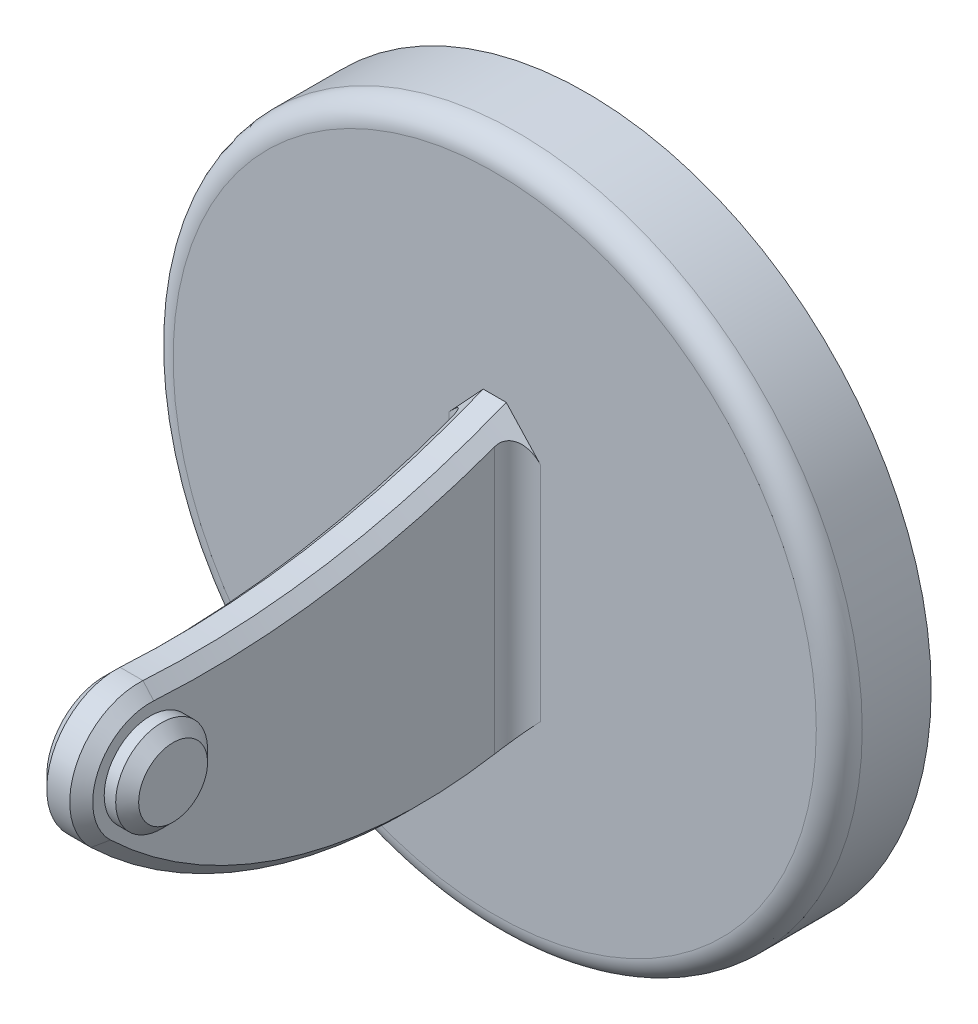
ISO-10303-21;
HEADER;
FILE_DESCRIPTION(('STEP AP214'),'2;1');
FILE_NAME('part.step','',(''),(''),'','','');
FILE_SCHEMA(('AUTOMOTIVE_DESIGN { 1 0 10303 214 1 1 1 1 }'));
ENDSEC;
DATA;
#1=APPLICATION_CONTEXT('core data for automotive mechanical design processes');
#2=APPLICATION_PROTOCOL_DEFINITION('international standard','automotive_design',2000,#1);
#3=PRODUCT_CONTEXT('',#1,'mechanical');
#4=PRODUCT('Part','Part','',(#3));
#5=PRODUCT_RELATED_PRODUCT_CATEGORY('part','',(#4));
#6=PRODUCT_DEFINITION_FORMATION('','',#4);
#7=PRODUCT_DEFINITION_CONTEXT('part definition',#1,'design');
#8=PRODUCT_DEFINITION('design','',#6,#7);
#9=PRODUCT_DEFINITION_SHAPE('','',#8);
#10=(LENGTH_UNIT() NAMED_UNIT(*) SI_UNIT(.MILLI.,.METRE.));
#11=(NAMED_UNIT(*) PLANE_ANGLE_UNIT() SI_UNIT($,.RADIAN.));
#12=(NAMED_UNIT(*) SI_UNIT($,.STERADIAN.) SOLID_ANGLE_UNIT());
#13=UNCERTAINTY_MEASURE_WITH_UNIT(LENGTH_MEASURE(1.E-05),#10,'distance_accuracy_value','');
#14=(GEOMETRIC_REPRESENTATION_CONTEXT(3) GLOBAL_UNCERTAINTY_ASSIGNED_CONTEXT((#13)) GLOBAL_UNIT_ASSIGNED_CONTEXT((#10,
#11,#12)) REPRESENTATION_CONTEXT('',''));
#15=CARTESIAN_POINT('',(0.,0.,0.));
#16=DIRECTION('',(0.,0.,1.));
#17=DIRECTION('',(1.,0.,0.));
#18=AXIS2_PLACEMENT_3D('',#15,#16,#17);
#19=CARTESIAN_POINT('',(0.,0.,20.));
#20=DIRECTION('',(0.,0.,-1.));
#21=DIRECTION('',(-1.,0.,0.));
#22=AXIS2_PLACEMENT_3D('',#19,#20,#21);
#23=CYLINDRICAL_SURFACE('',#22,75.);
#24=CARTESIAN_POINT('',(0.,0.,15.));
#25=DIRECTION('',(0.,0.,1.));
#26=DIRECTION('',(1.,0.,0.));
#27=AXIS2_PLACEMENT_3D('',#24,#25,#26);
#28=CIRCLE('',#27,75.);
#29=CARTESIAN_POINT('',(75.,0.,15.));
#30=VERTEX_POINT('',#29);
#31=EDGE_CURVE('E142',#30,#30,#28,.F.);
#32=ORIENTED_EDGE('',*,*,#31,.T.);
#33=EDGE_LOOP('',(#32));
#34=FACE_BOUND('',#33,.T.);
#35=CARTESIAN_POINT('',(0.,0.,0.));
#36=DIRECTION('',(0.,0.,1.));
#37=DIRECTION('',(1.,0.,0.));
#38=AXIS2_PLACEMENT_3D('',#35,#36,#37);
#39=CIRCLE('',#38,75.);
#40=CARTESIAN_POINT('',(75.,0.,0.));
#41=VERTEX_POINT('',#40);
#42=EDGE_CURVE('E310',#41,#41,#39,.T.);
#43=ORIENTED_EDGE('',*,*,#42,.T.);
#44=EDGE_LOOP('',(#43));
#45=FACE_BOUND('',#44,.T.);
#46=ADVANCED_FACE('F41',(#34,#45),#23,.T.);
#47=CARTESIAN_POINT('',(0.,0.,20.));
#48=DIRECTION('',(0.,0.,1.));
#49=DIRECTION('',(1.,0.,0.));
#50=AXIS2_PLACEMENT_3D('',#47,#48,#49);
#51=PLANE('',#50);
#52=DIRECTION('',(0.,1.,0.));
#53=VECTOR('',#52,1.);
#54=CARTESIAN_POINT('',(-10.,0.,20.));
#55=LINE('',#54,#53);
#56=CARTESIAN_POINT('',(-10.,-28.5347400447998,20.));
#57=VERTEX_POINT('',#56);
#58=CARTESIAN_POINT('',(-10.,19.8084097202197,20.));
#59=VERTEX_POINT('',#58);
#60=EDGE_CURVE('E276',#57,#59,#55,.T.);
#61=ORIENTED_EDGE('',*,*,#60,.T.);
#62=CARTESIAN_POINT('',(-10.,19.8084097202197,20.));
#63=CARTESIAN_POINT('',(-9.16574365323036,20.7032286114695,20.));
#64=CARTESIAN_POINT('',(-8.33193432974239,21.5984643871198,20.));
#65=CARTESIAN_POINT('',(-6.6652533617684,23.3898068938445,20.));
#66=CARTESIAN_POINT('',(-5.83238171646611,24.2859136241594,20.));
#67=CARTESIAN_POINT('',(-4.16616784041951,26.0805990637617,20.));
#68=CARTESIAN_POINT('',(-3.33282731858596,26.979179359604,20.));
#69=CARTESIAN_POINT('',(-2.50000000000003,27.8782351753599,20.));
#70=B_SPLINE_CURVE_WITH_KNOTS('',3,(#62,#63,#64,#65,#66,#67,#68,#69),.UNSPECIFIED.,.F.,.F.,(4,2,
2,4),(0.,3.67017170974664,7.34034022201677,11.0169040821687),.UNSPECIFIED.);
#71=CARTESIAN_POINT('',(-2.50000000000003,27.8782351753599,20.));
#72=VERTEX_POINT('',#71);
#73=EDGE_CURVE('E131',#59,#72,#70,.T.);
#74=ORIENTED_EDGE('',*,*,#73,.T.);
#75=DIRECTION('',(-1.,0.,0.));
#76=VECTOR('',#75,1.);
#77=CARTESIAN_POINT('',(5.,27.8782351753599,20.));
#78=LINE('',#77,#76);
#79=CARTESIAN_POINT('',(2.50000000000011,27.8782351753599,20.));
#80=VERTEX_POINT('',#79);
#81=EDGE_CURVE('E141',#80,#72,#78,.T.);
#82=ORIENTED_EDGE('',*,*,#81,.F.);
#83=CARTESIAN_POINT('',(2.50000000000011,27.8782351753599,20.));
#84=CARTESIAN_POINT('',(3.33282731858601,26.979179359604,20.));
#85=CARTESIAN_POINT('',(4.16616784041952,26.0805990637617,20.));
#86=CARTESIAN_POINT('',(5.8323817164661,24.2859136241593,20.));
#87=CARTESIAN_POINT('',(6.66525336176839,23.3898068938444,20.));
#88=CARTESIAN_POINT('',(8.33193432974238,21.5984643871197,20.));
#89=CARTESIAN_POINT('',(9.16574365323035,20.7032286114694,20.));
#90=CARTESIAN_POINT('',(10.,19.8084097202195,20.));
#91=B_SPLINE_CURVE_WITH_KNOTS('',3,(#83,#84,#85,#86,#87,#88,#89,#90),.UNSPECIFIED.,.F.,.F.,(4,2,
2,4),(0.,3.67656386015188,7.34673237242206,11.0169040821688),.UNSPECIFIED.);
#92=CARTESIAN_POINT('',(10.,19.8084097202195,20.));
#93=VERTEX_POINT('',#92);
#94=EDGE_CURVE('E130',#80,#93,#91,.T.);
#95=ORIENTED_EDGE('',*,*,#94,.T.);
#96=DIRECTION('',(0.,1.,0.));
#97=VECTOR('',#96,1.);
#98=CARTESIAN_POINT('',(10.,-33.6654972978262,20.));
#99=LINE('',#98,#97);
#100=CARTESIAN_POINT('',(10.,-28.5347400447897,20.));
#101=VERTEX_POINT('',#100);
#102=EDGE_CURVE('E128',#93,#101,#99,.F.);
#103=ORIENTED_EDGE('',*,*,#102,.T.);
#104=CARTESIAN_POINT('',(9.99999999999999,-28.5347400447897,20.));
#105=CARTESIAN_POINT('',(9.1672779060872,-29.3904619495378,20.));
#106=CARTESIAN_POINT('',(8.33423473892486,-30.2458713230867,20.));
#107=CARTESIAN_POINT('',(6.6675526869515,-31.9561089872226,20.));
#108=CARTESIAN_POINT('',(5.83391380233608,-32.8109372780004,20.));
#109=CARTESIAN_POINT('',(4.16693335697095,-34.5191891841924,20.));
#110=CARTESIAN_POINT('',(3.33359235450628,-35.372613344394,20.));
#111=CARTESIAN_POINT('',(2.50000000000011,-36.2257918410724,20.));
#112=B_SPLINE_CURVE_WITH_KNOTS('',3,(#104,#105,#106,#107,#108,#109,#110,#111),.UNSPECIFIED.,.F.,
.F.,(4,2,2,4),(0.,3.582062711158,7.16412424671807,10.7425468249187),.UNSPECIFIED.);
#113=CARTESIAN_POINT('',(2.50000000000011,-36.2257918410724,20.));
#114=VERTEX_POINT('',#113);
#115=EDGE_CURVE('E122',#101,#114,#112,.T.);
#116=ORIENTED_EDGE('',*,*,#115,.T.);
#117=DIRECTION('',(-1.,0.,0.));
#118=VECTOR('',#117,1.);
#119=CARTESIAN_POINT('',(5.,-36.2257918410724,20.));
#120=LINE('',#119,#118);
#121=CARTESIAN_POINT('',(-2.50000000000003,-36.2257918410724,20.));
#122=VERTEX_POINT('',#121);
#123=EDGE_CURVE('E127',#114,#122,#120,.T.);
#124=ORIENTED_EDGE('',*,*,#123,.T.);
#125=CARTESIAN_POINT('',(-2.50000000000003,-36.2257918410724,20.));
#126=CARTESIAN_POINT('',(-3.33359235450623,-35.372613344394,20.));
#127=CARTESIAN_POINT('',(-4.16693335697092,-34.5191891841924,20.));
#128=CARTESIAN_POINT('',(-5.83391380233446,-32.8109372780021,20.));
#129=CARTESIAN_POINT('',(-6.66755268694827,-31.956108987226,20.));
#130=CARTESIAN_POINT('',(-8.33423473891839,-30.2458713230934,20.));
#131=CARTESIAN_POINT('',(-9.16727790607911,-29.3904619495463,20.));
#132=CARTESIAN_POINT('',(-9.99999999999028,-28.5347400447998,20.));
#133=B_SPLINE_CURVE_WITH_KNOTS('',3,(#125,#126,#127,#128,#129,#130,#131,#132),.UNSPECIFIED.,.F.,
.F.,(4,2,2,4),(0.,3.57842257820065,7.1604841137537,10.7425468249047),.UNSPECIFIED.);
#134=EDGE_CURVE('E174',#122,#57,#133,.T.);
#135=ORIENTED_EDGE('',*,*,#134,.T.);
#136=EDGE_LOOP('',(#61,#74,#82,#95,#103,#116,#124,#135));
#137=FACE_BOUND('',#136,.T.);
#138=CARTESIAN_POINT('',(0.,0.,20.));
#139=DIRECTION('',(0.,0.,1.));
#140=DIRECTION('',(1.,0.,0.));
#141=AXIS2_PLACEMENT_3D('',#138,#139,#140);
#142=CIRCLE('',#141,70.);
#143=CARTESIAN_POINT('',(70.,0.,20.));
#144=VERTEX_POINT('',#143);
#145=EDGE_CURVE('E313',#144,#144,#142,.T.);
#146=ORIENTED_EDGE('',*,*,#145,.T.);
#147=EDGE_LOOP('',(#146));
#148=FACE_BOUND('',#147,.T.);
#149=ADVANCED_FACE('F125',(#137,#148),#51,.T.);
#150=CARTESIAN_POINT('',(0.,0.,0.));
#151=DIRECTION('',(0.,0.,1.));
#152=DIRECTION('',(1.,0.,0.));
#153=AXIS2_PLACEMENT_3D('',#150,#151,#152);
#154=PLANE('',#153);
#155=ORIENTED_EDGE('',*,*,#42,.F.);
#156=EDGE_LOOP('',(#155));
#157=FACE_BOUND('',#156,.T.);
#158=ADVANCED_FACE('F196',(#157),#154,.F.);
#159=CARTESIAN_POINT('',(0.,0.,15.));
#160=DIRECTION('',(0.,0.,1.));
#161=DIRECTION('',(1.,0.,0.));
#162=AXIS2_PLACEMENT_3D('',#159,#160,#161);
#163=TOROIDAL_SURFACE('',#162,70.,5.);
#164=ORIENTED_EDGE('',*,*,#31,.F.);
#165=EDGE_LOOP('',(#164));
#166=FACE_BOUND('',#165,.T.);
#167=ORIENTED_EDGE('',*,*,#145,.F.);
#168=EDGE_LOOP('',(#167));
#169=FACE_BOUND('',#168,.T.);
#170=ADVANCED_FACE('F326',(#166,#169),#163,.T.);
#171=CARTESIAN_POINT('',(5.,194.618391581677,87.8064911464742));
#172=DIRECTION('',(-1.,0.,0.));
#173=DIRECTION('',(0.,0.,1.));
#174=AXIS2_PLACEMENT_3D('',#171,#172,#173);
#175=CYLINDRICAL_SURFACE('',#174,180.);
#176=ORIENTED_EDGE('',*,*,#81,.T.);
#177=CARTESIAN_POINT('',(-2.50000000000003,194.618391581677,87.8064911464742));
#178=DIRECTION('',(1.,0.,0.));
#179=DIRECTION('',(0.,0.,-1.));
#180=AXIS2_PLACEMENT_3D('',#177,#178,#179);
#181=CIRCLE('',#180,180.);
#182=CARTESIAN_POINT('',(-2.50000000000003,14.9706455062829,99.062037780498));
#183=VERTEX_POINT('',#182);
#184=EDGE_CURVE('E166',#72,#183,#181,.F.);
#185=ORIENTED_EDGE('',*,*,#184,.T.);
#186=DIRECTION('',(-1.,0.,0.));
#187=VECTOR('',#186,1.);
#188=CARTESIAN_POINT('',(5.,14.9706455062829,99.062037780498));
#189=LINE('',#188,#187);
#190=CARTESIAN_POINT('',(2.50000000000011,14.9706455062829,99.062037780498));
#191=VERTEX_POINT('',#190);
#192=EDGE_CURVE('E304',#191,#183,#189,.T.);
#193=ORIENTED_EDGE('',*,*,#192,.F.);
#194=CARTESIAN_POINT('',(2.50000000000011,194.618391581677,87.8064911464742));
#195=DIRECTION('',(1.,0.,0.));
#196=DIRECTION('',(0.,0.,-1.));
#197=AXIS2_PLACEMENT_3D('',#194,#195,#196);
#198=CIRCLE('',#197,180.);
#199=EDGE_CURVE('E164',#191,#80,#198,.T.);
#200=ORIENTED_EDGE('',*,*,#199,.T.);
#201=EDGE_LOOP('',(#176,#185,#193,#200));
#202=FACE_BOUND('',#201,.T.);
#203=ADVANCED_FACE('F197',(#202),#175,.F.);
#204=CARTESIAN_POINT('',(5.,0.,100.));
#205=DIRECTION('',(-1.,0.,0.));
#206=DIRECTION('',(0.,0.,1.));
#207=AXIS2_PLACEMENT_3D('',#204,#205,#206);
#208=CYLINDRICAL_SURFACE('',#207,15.);
#209=ORIENTED_EDGE('',*,*,#192,.T.);
#210=CARTESIAN_POINT('',(-2.50000000000003,0.,100.));
#211=DIRECTION('',(1.,0.,0.));
#212=DIRECTION('',(0.,0.,-1.));
#213=AXIS2_PLACEMENT_3D('',#210,#211,#212);
#214=CIRCLE('',#213,15.);
#215=CARTESIAN_POINT('',(-2.50000000000003,-10.8492014290604,110.358321695703));
#216=VERTEX_POINT('',#215);
#217=EDGE_CURVE('E162',#183,#216,#214,.T.);
#218=ORIENTED_EDGE('',*,*,#217,.T.);
#219=DIRECTION('',(-1.,0.,0.));
#220=VECTOR('',#219,1.);
#221=CARTESIAN_POINT('',(5.,-10.8492014290604,110.358321695703));
#222=LINE('',#221,#220);
#223=CARTESIAN_POINT('',(2.50000000000011,-10.8492014290604,110.358321695703));
#224=VERTEX_POINT('',#223);
#225=EDGE_CURVE('E289',#224,#216,#222,.T.);
#226=ORIENTED_EDGE('',*,*,#225,.F.);
#227=CARTESIAN_POINT('',(2.50000000000011,0.,100.));
#228=DIRECTION('',(1.,0.,0.));
#229=DIRECTION('',(0.,0.,-1.));
#230=AXIS2_PLACEMENT_3D('',#227,#228,#229);
#231=CIRCLE('',#230,15.);
#232=EDGE_CURVE('E160',#224,#191,#231,.F.);
#233=ORIENTED_EDGE('',*,*,#232,.T.);
#234=EDGE_LOOP('',(#209,#218,#226,#233));
#235=FACE_BOUND('',#234,.T.);
#236=ADVANCED_FACE('F308',(#235),#208,.T.);
#237=CARTESIAN_POINT('',(5.,61.4788080980091,41.3028437243492));
#238=DIRECTION('',(-1.,0.,0.));
#239=DIRECTION('',(0.,0.,1.));
#240=AXIS2_PLACEMENT_3D('',#237,#238,#239);
#241=CYLINDRICAL_SURFACE('',#240,100.);
#242=ORIENTED_EDGE('',*,*,#225,.T.);
#243=CARTESIAN_POINT('',(-2.50000000000003,61.4788080980091,41.3028437243492));
#244=DIRECTION('',(1.,0.,0.));
#245=DIRECTION('',(0.,0.,-1.));
#246=AXIS2_PLACEMENT_3D('',#243,#244,#245);
#247=CIRCLE('',#246,100.);
#248=EDGE_CURVE('E140',#216,#122,#247,.T.);
#249=ORIENTED_EDGE('',*,*,#248,.T.);
#250=ORIENTED_EDGE('',*,*,#123,.F.);
#251=CARTESIAN_POINT('',(2.50000000000011,61.4788080980091,41.3028437243492));
#252=DIRECTION('',(1.,0.,0.));
#253=DIRECTION('',(0.,0.,-1.));
#254=AXIS2_PLACEMENT_3D('',#251,#252,#253);
#255=CIRCLE('',#254,100.);
#256=EDGE_CURVE('E137',#114,#224,#255,.F.);
#257=ORIENTED_EDGE('',*,*,#256,.T.);
#258=EDGE_LOOP('',(#242,#249,#250,#257));
#259=FACE_BOUND('',#258,.T.);
#260=ADVANCED_FACE('F136',(#259),#241,.T.);
#261=CARTESIAN_POINT('',(5.,194.618391581677,87.8064911464742));
#262=DIRECTION('',(1.,0.,0.));
#263=DIRECTION('',(0.,0.,-1.));
#264=AXIS2_PLACEMENT_3D('',#261,#262,#263);
#265=PLANE('',#264);
#266=CARTESIAN_POINT('',(5.,0.,100.));
#267=DIRECTION('',(1.,0.,0.));
#268=DIRECTION('',(0.,0.,-1.));
#269=AXIS2_PLACEMENT_3D('',#266,#267,#268);
#270=CIRCLE('',#269,10.);
#271=CARTESIAN_POINT('',(5.,0.,90.));
#272=VERTEX_POINT('',#271);
#273=EDGE_CURVE('E286',#272,#272,#270,.T.);
#274=ORIENTED_EDGE('',*,*,#273,.F.);
#275=EDGE_LOOP('',(#274));
#276=FACE_BOUND('',#275,.T.);
#277=CARTESIAN_POINT('',(5.,61.4788080980091,41.3028437243492));
#278=DIRECTION('',(1.,0.,0.));
#279=DIRECTION('',(0.,0.,-1.));
#280=AXIS2_PLACEMENT_3D('',#277,#278,#279);
#281=CIRCLE('',#280,97.5000000000001);
#282=CARTESIAN_POINT('',(5.,-9.04100119088376,108.631934746419));
#283=VERTEX_POINT('',#282);
#284=CARTESIAN_POINT('',(5.,-34.6485412178826,25.));
#285=VERTEX_POINT('',#284);
#286=EDGE_CURVE('E172',#283,#285,#281,.T.);
#287=ORIENTED_EDGE('',*,*,#286,.T.);
#288=DIRECTION('',(0.,1.,0.));
#289=VECTOR('',#288,1.);
#290=CARTESIAN_POINT('',(5.,25.1824752050036,25.));
#291=LINE('',#290,#289);
#292=CARTESIAN_POINT('',(5.,23.2661384016625,25.));
#293=VERTEX_POINT('',#292);
#294=EDGE_CURVE('E269',#285,#293,#291,.T.);
#295=ORIENTED_EDGE('',*,*,#294,.T.);
#296=CARTESIAN_POINT('',(5.,194.618391581677,87.8064911464742));
#297=DIRECTION('',(1.,0.,0.));
#298=DIRECTION('',(0.,0.,-1.));
#299=AXIS2_PLACEMENT_3D('',#296,#297,#298);
#300=CIRCLE('',#299,182.5);
#301=CARTESIAN_POINT('',(5.,12.4755379219025,99.2183648170816));
#302=VERTEX_POINT('',#301);
#303=EDGE_CURVE('E168',#293,#302,#300,.F.);
#304=ORIENTED_EDGE('',*,*,#303,.T.);
#305=CARTESIAN_POINT('',(5.,0.,100.));
#306=DIRECTION('',(1.,0.,0.));
#307=DIRECTION('',(0.,0.,-1.));
#308=AXIS2_PLACEMENT_3D('',#305,#306,#307);
#309=CIRCLE('',#308,12.5000000000001);
#310=EDGE_CURVE('E170',#302,#283,#309,.T.);
#311=ORIENTED_EDGE('',*,*,#310,.T.);
#312=EDGE_LOOP('',(#287,#295,#304,#311));
#313=FACE_BOUND('',#312,.T.);
#314=ADVANCED_FACE('F375',(#276,#313),#265,.T.);
#315=CARTESIAN_POINT('',(-5.,194.618391581677,87.8064911464742));
#316=DIRECTION('',(1.,0.,0.));
#317=DIRECTION('',(0.,0.,-1.));
#318=AXIS2_PLACEMENT_3D('',#315,#316,#317);
#319=PLANE('',#318);
#320=CARTESIAN_POINT('',(-5.,0.,100.));
#321=DIRECTION('',(-1.,0.,0.));
#322=DIRECTION('',(0.,0.,1.));
#323=AXIS2_PLACEMENT_3D('',#320,#321,#322);
#324=CIRCLE('',#323,5.);
#325=CARTESIAN_POINT('',(-5.,0.,105.));
#326=VERTEX_POINT('',#325);
#327=EDGE_CURVE('E500',#326,#326,#324,.T.);
#328=ORIENTED_EDGE('',*,*,#327,.F.);
#329=EDGE_LOOP('',(#328));
#330=FACE_BOUND('',#329,.T.);
#331=CARTESIAN_POINT('',(-5.,194.618391581677,87.8064911464742));
#332=DIRECTION('',(1.,0.,0.));
#333=DIRECTION('',(0.,0.,-1.));
#334=AXIS2_PLACEMENT_3D('',#331,#332,#333);
#335=CIRCLE('',#334,182.5);
#336=CARTESIAN_POINT('',(-5.,12.4755379219024,99.2183648170816));
#337=VERTEX_POINT('',#336);
#338=CARTESIAN_POINT('',(-5.,23.2661384016625,25.));
#339=VERTEX_POINT('',#338);
#340=EDGE_CURVE('E149',#337,#339,#335,.T.);
#341=ORIENTED_EDGE('',*,*,#340,.T.);
#342=DIRECTION('',(0.,1.,0.));
#343=VECTOR('',#342,1.);
#344=CARTESIAN_POINT('',(-5.,194.618391581677,25.));
#345=LINE('',#344,#343);
#346=CARTESIAN_POINT('',(-5.,-34.6485412178826,25.));
#347=VERTEX_POINT('',#346);
#348=EDGE_CURVE('E273',#339,#347,#345,.F.);
#349=ORIENTED_EDGE('',*,*,#348,.T.);
#350=CARTESIAN_POINT('',(-5.,61.4788080980091,41.3028437243492));
#351=DIRECTION('',(1.,0.,0.));
#352=DIRECTION('',(0.,0.,-1.));
#353=AXIS2_PLACEMENT_3D('',#350,#351,#352);
#354=CIRCLE('',#353,97.5000000000001);
#355=CARTESIAN_POINT('',(-5.,-9.04100119088373,108.631934746419));
#356=VERTEX_POINT('',#355);
#357=EDGE_CURVE('E158',#347,#356,#354,.F.);
#358=ORIENTED_EDGE('',*,*,#357,.T.);
#359=CARTESIAN_POINT('',(-5.,0.,100.));
#360=DIRECTION('',(1.,0.,0.));
#361=DIRECTION('',(0.,0.,-1.));
#362=AXIS2_PLACEMENT_3D('',#359,#360,#361);
#363=CIRCLE('',#362,12.5000000000001);
#364=EDGE_CURVE('E156',#356,#337,#363,.F.);
#365=ORIENTED_EDGE('',*,*,#364,.T.);
#366=EDGE_LOOP('',(#341,#349,#358,#365));
#367=FACE_BOUND('',#366,.T.);
#368=ADVANCED_FACE('F298',(#330,#367),#319,.F.);
#369=CARTESIAN_POINT('',(-5.,194.618391581677,87.8064911464742));
#370=DIRECTION('',(-1.,0.,0.));
#371=DIRECTION('',(0.,0.,1.));
#372=AXIS2_PLACEMENT_3D('',#369,#370,#371);
#373=CONICAL_SURFACE('',#372,182.5,0.785398163397443);
#374=ORIENTED_EDGE('',*,*,#73,.F.);
#375=CARTESIAN_POINT('',(-10.,19.8084097202197,20.));
#376=CARTESIAN_POINT('',(-9.85714704113473,19.9616222001361,20.0000298804788));
#377=CARTESIAN_POINT('',(-9.71309524720428,20.1137924014272,20.0061250464787));
#378=CARTESIAN_POINT('',(-9.42286389259005,20.4154099258564,20.0312732005136));
#379=CARTESIAN_POINT('',(-9.2766815742706,20.5648530266058,20.0503447774578));
#380=CARTESIAN_POINT('',(-8.98125926298964,20.8615528966935,20.102562652016));
#381=CARTESIAN_POINT('',(-8.83200332023086,21.0087676549956,20.1358611613083));
#382=CARTESIAN_POINT('',(-8.53280806026068,21.2980316141235,20.2175964036354));
#383=CARTESIAN_POINT('',(-8.38286919811181,21.4400838108926,20.2660241950172));
#384=CARTESIAN_POINT('',(-8.01276165533594,21.7828151280986,20.4058352198909));
#385=CARTESIAN_POINT('',(-7.79259954802384,21.9797828513876,20.5067135935973));
#386=CARTESIAN_POINT('',(-7.35729519112308,22.3528762269488,20.7482032050806));
#387=CARTESIAN_POINT('',(-7.14213841034352,22.5290705137558,20.8886780845711));
#388=CARTESIAN_POINT('',(-6.76898245708678,22.8168193138977,21.1785477540737));
#389=CARTESIAN_POINT('',(-6.60875060095628,22.9340909878663,21.319317167827));
#390=CARTESIAN_POINT('',(-6.30040897895643,23.144778257543,21.6294430522973));
#391=CARTESIAN_POINT('',(-6.15228837499194,23.2382153446303,21.7987735392682));
#392=CARTESIAN_POINT('',(-5.89995104941319,23.3804737185195,22.1320581970212));
#393=CARTESIAN_POINT('',(-5.79262885058203,23.4342962789321,22.2915049540279));
#394=CARTESIAN_POINT('',(-5.59504489142649,23.5179262343764,22.6263855761311));
#395=CARTESIAN_POINT('',(-5.50476286123897,23.5477623016995,22.8018000739712));
#396=CARTESIAN_POINT('',(-5.34473112728065,23.5813327898914,23.1648092903735));
#397=CARTESIAN_POINT('',(-5.27504398310996,23.5849884501377,23.3524390501042));
#398=CARTESIAN_POINT('',(-5.15889768650511,23.5658130806126,23.733709875505));
#399=CARTESIAN_POINT('',(-5.11247061551666,23.5429456120539,23.9273588546123));
#400=CARTESIAN_POINT('',(-5.05137708232072,23.4808763212381,24.2692712797722));
#401=CARTESIAN_POINT('',(-5.03183845273442,23.4467017445591,24.4176298806951));
#402=CARTESIAN_POINT('',(-5.01257591131647,23.3858266399033,24.63802725972));
#403=CARTESIAN_POINT('',(-5.00782892798884,23.3639728403138,24.7110279587234));
#404=CARTESIAN_POINT('',(-5.00154052901006,23.3172604092299,24.8561887780631));
#405=CARTESIAN_POINT('',(-4.99999854031963,23.2924023157315,24.92834904637));
#406=CARTESIAN_POINT('',(-4.99999999999999,23.2661384016625,25.));
#407=B_SPLINE_CURVE_WITH_KNOTS('',3,(#375,#376,#377,#378,#379,#380,#381,#382,#383,#384,#385,
#386,#387,#388,#389,#390,#391,#392,#393,#394,#395,#396,#397,#398,#399,#400,#401,#402,#403,#404,
#405,#406),.UNSPECIFIED.,.F.,.F.,(4,2,2,2,2,2,2,2,2,2,2,2,2,2,2,4),(0.,0.628421039599242,
1.25774420264552,1.89397597557041,2.52983243422467,3.46357701051967,4.39414453597983,
5.12178326458134,5.84876355163267,6.44503340286865,7.04058943781573,7.63793638210258,
8.23610496423002,8.69534624701095,8.92427835401004,9.15316952540911),.UNSPECIFIED.);
#408=EDGE_CURVE('E253',#59,#339,#407,.T.);
#409=ORIENTED_EDGE('',*,*,#408,.T.);
#410=ORIENTED_EDGE('',*,*,#340,.F.);
#411=DIRECTION('',(-0.70710678118655,-0.705722997082166,0.0442159630604432));
#412=VECTOR('',#411,1.);
#413=CARTESIAN_POINT('',(-2.50000000000003,14.9706455062829,99.062037780498));
#414=LINE('',#413,#412);
#415=EDGE_CURVE('E287',#183,#337,#414,.T.);
#416=ORIENTED_EDGE('',*,*,#415,.F.);
#417=ORIENTED_EDGE('',*,*,#184,.F.);
#418=EDGE_LOOP('',(#374,#409,#410,#416,#417));
#419=FACE_BOUND('',#418,.T.);
#420=ADVANCED_FACE('F225',(#419),#373,.F.);
#421=CARTESIAN_POINT('',(-2.50000000000003,0.,100.));
#422=DIRECTION('',(1.,0.,0.));
#423=DIRECTION('',(0.,0.,-1.));
#424=AXIS2_PLACEMENT_3D('',#421,#422,#423);
#425=CONICAL_SURFACE('',#424,15.,0.785398163397445);
#426=ORIENTED_EDGE('',*,*,#415,.T.);
#427=ORIENTED_EDGE('',*,*,#364,.F.);
#428=DIRECTION('',(-0.70710678118655,0.51143626006316,-0.488295967516223));
#429=VECTOR('',#428,1.);
#430=CARTESIAN_POINT('',(-2.50000000000003,-10.8492014290604,110.358321695703));
#431=LINE('',#430,#429);
#432=EDGE_CURVE('E284',#216,#356,#431,.T.);
#433=ORIENTED_EDGE('',*,*,#432,.F.);
#434=ORIENTED_EDGE('',*,*,#217,.F.);
#435=EDGE_LOOP('',(#426,#427,#433,#434));
#436=FACE_BOUND('',#435,.T.);
#437=ADVANCED_FACE('F295',(#436),#425,.T.);
#438=CARTESIAN_POINT('',(-2.50000000000003,61.4788080980091,41.3028437243492));
#439=DIRECTION('',(1.,0.,0.));
#440=DIRECTION('',(0.,0.,-1.));
#441=AXIS2_PLACEMENT_3D('',#438,#439,#440);
#442=CONICAL_SURFACE('',#441,100.,0.785398163397443);
#443=ORIENTED_EDGE('',*,*,#432,.T.);
#444=ORIENTED_EDGE('',*,*,#357,.F.);
#445=CARTESIAN_POINT('',(-5.,-34.6485412178826,25.));
#446=CARTESIAN_POINT('',(-4.99997205696549,-34.6278263931646,24.8776737195309));
#447=CARTESIAN_POINT('',(-5.00448739117207,-34.6024065399033,24.7562262915276));
#448=CARTESIAN_POINT('',(-5.02201019394859,-34.5429849208856,24.5162780856462));
#449=CARTESIAN_POINT('',(-5.03500349551893,-34.508997529844,24.3977727337697));
#450=CARTESIAN_POINT('',(-5.06870753536354,-34.4336064530608,24.1657504184647));
#451=CARTESIAN_POINT('',(-5.08933290323475,-34.3922873438699,24.0521932495797));
#452=CARTESIAN_POINT('',(-5.13763804893629,-34.3028186663442,23.8293395597508));
#453=CARTESIAN_POINT('',(-5.16532067014758,-34.2546663483715,23.7200447766429));
#454=CARTESIAN_POINT('',(-5.25749953763443,-34.1018999874642,23.4007855163625));
#455=CARTESIAN_POINT('',(-5.33139897333395,-33.988389425009,23.1977010164338));
#456=CARTESIAN_POINT('',(-5.49947966844372,-33.743108128065,22.8114075187661));
#457=CARTESIAN_POINT('',(-5.59372608368114,-33.6112792288649,22.6282652833932));
#458=CARTESIAN_POINT('',(-5.77930779563058,-33.3597715899798,22.3143795242672));
#459=CARTESIAN_POINT('',(-5.86796813176538,-33.2423430904442,22.1802045011359));
#460=CARTESIAN_POINT('',(-6.05419427532001,-33.0003701704359,21.9250062885372));
#461=CARTESIAN_POINT('',(-6.15176446112315,-32.875822262786,21.803989629899));
#462=CARTESIAN_POINT('',(-6.35451763345837,-32.6209581839141,21.574515672378));
#463=CARTESIAN_POINT('',(-6.45971443821715,-32.4906317175558,21.4660821453441));
#464=CARTESIAN_POINT('',(-6.67639624695992,-32.2256565914919,21.261571364397));
#465=CARTESIAN_POINT('',(-6.78788093181872,-32.0910081512862,21.1654934842151));
#466=CARTESIAN_POINT('',(-7.0591623462626,-31.7670829795191,20.9513521781691));
#467=CARTESIAN_POINT('',(-7.22136644551831,-31.5762977372456,20.8386006241572));
#468=CARTESIAN_POINT('',(-7.55407285197028,-31.1903799013301,20.6347373401019));
#469=CARTESIAN_POINT('',(-7.72457887087089,-30.9952453847092,20.543635398434));
#470=CARTESIAN_POINT('',(-8.0722527946392,-30.6024455629517,20.3825905264103));
#471=CARTESIAN_POINT('',(-8.2494168170551,-30.4047817757245,20.312635473578));
#472=CARTESIAN_POINT('',(-8.6091926419597,-30.0083154260173,20.1935947017099));
#473=CARTESIAN_POINT('',(-8.79180196315535,-29.8095134145848,20.144499628215));
#474=CARTESIAN_POINT('',(-9.14430295407236,-29.4304409321061,20.0707858186542));
#475=CARTESIAN_POINT('',(-9.31380200505616,-29.2501629713126,20.0443183217429));
#476=CARTESIAN_POINT('',(-9.65518491269283,-28.8911755946431,20.0089730286601));
#477=CARTESIAN_POINT('',(-9.82706013433483,-28.7124631020957,20.0000429318062));
#478=CARTESIAN_POINT('',(-9.9999999999949,-28.5347400447951,20.));
#479=B_SPLINE_CURVE_WITH_KNOTS('',3,(#445,#446,#447,#448,#449,#450,#451,#452,#453,#454,#455,
#456,#457,#458,#459,#460,#461,#462,#463,#464,#465,#466,#467,#468,#469,#470,#471,#472,#473,#474,
#475,#476,#477,#478),.UNSPECIFIED.,.F.,.F.,(4,2,2,2,2,2,2,2,2,2,2,2,2,2,2,2,4),(0.,
0.371910340457607,0.743200791013912,1.11045779196236,1.47786299596239,2.20715942536887,
2.93882682183088,3.53541228861899,4.13229251712417,4.73028261116159,5.32824238300981,
6.15097947183993,6.97408783764375,7.79672345698733,8.61898978287105,9.36494146338204,
10.108665140544),.UNSPECIFIED.);
#480=EDGE_CURVE('E259',#347,#57,#479,.T.);
#481=ORIENTED_EDGE('',*,*,#480,.T.);
#482=ORIENTED_EDGE('',*,*,#134,.F.);
#483=ORIENTED_EDGE('',*,*,#248,.F.);
#484=EDGE_LOOP('',(#443,#444,#481,#482,#483));
#485=FACE_BOUND('',#484,.T.);
#486=ADVANCED_FACE('F188',(#485),#442,.T.);
#487=CARTESIAN_POINT('',(2.50000000000011,194.618391581677,87.8064911464742));
#488=DIRECTION('',(1.,0.,0.));
#489=DIRECTION('',(0.,0.,-1.));
#490=AXIS2_PLACEMENT_3D('',#487,#488,#489);
#491=CONICAL_SURFACE('',#490,180.,0.785398163397459);
#492=ORIENTED_EDGE('',*,*,#94,.F.);
#493=ORIENTED_EDGE('',*,*,#199,.F.);
#494=DIRECTION('',(-0.707106781186542,0.705722997082173,-0.0442159630604442));
#495=VECTOR('',#494,1.);
#496=CARTESIAN_POINT('',(5.,12.4755379219025,99.2183648170816));
#497=LINE('',#496,#495);
#498=EDGE_CURVE('E281',#302,#191,#497,.T.);
#499=ORIENTED_EDGE('',*,*,#498,.F.);
#500=ORIENTED_EDGE('',*,*,#303,.F.);
#501=CARTESIAN_POINT('',(5.,23.2661384016625,25.));
#502=CARTESIAN_POINT('',(4.99998982101167,23.3002005671834,24.9070970588888));
#503=CARTESIAN_POINT('',(5.00258916549921,23.331900365859,24.8132947634358));
#504=CARTESIAN_POINT('',(5.01323591479231,23.3901604515584,24.624343126443));
#505=CARTESIAN_POINT('',(5.02128721893148,23.4167170425788,24.5291928685387));
#506=CARTESIAN_POINT('',(5.04308274610182,23.4642590261446,24.3379983044757));
#507=CARTESIAN_POINT('',(5.05683489026829,23.4852365999854,24.2419529368186));
#508=CARTESIAN_POINT('',(5.09015681555101,23.5211837982654,24.0497650147842));
#509=CARTESIAN_POINT('',(5.10972516880294,23.5361548951621,23.9536224900255));
#510=CARTESIAN_POINT('',(5.15480488443814,23.5598434730771,23.7615087850931));
#511=CARTESIAN_POINT('',(5.18034165170113,23.5685335526407,23.6655401561134));
#512=CARTESIAN_POINT('',(5.23722376580067,23.5793589711211,23.4749236099918));
#513=CARTESIAN_POINT('',(5.26857117691084,23.5814919758391,23.3802761751035));
#514=CARTESIAN_POINT('',(5.33677201100208,23.5791344482647,23.1932936963799));
#515=CARTESIAN_POINT('',(5.37361387353917,23.5746576512135,23.1009542616797));
#516=CARTESIAN_POINT('',(5.45252524641228,23.5591775223306,22.919061246429));
#517=CARTESIAN_POINT('',(5.49459672245525,23.5481717304809,22.8295087293356));
#518=CARTESIAN_POINT('',(5.58133674973435,23.5205328957291,22.6581681393705));
#519=CARTESIAN_POINT('',(5.62577615786902,23.5042028834638,22.5762147571267));
#520=CARTESIAN_POINT('',(5.71855815688244,23.4660960259121,22.4158463901558));
#521=CARTESIAN_POINT('',(5.76690202034876,23.4443173998561,22.3374325721739));
#522=CARTESIAN_POINT('',(5.91717329223243,23.3712669897885,22.1079558946016));
#523=CARTESIAN_POINT('',(6.02432427062641,23.3122859316016,21.9626892734793));
#524=CARTESIAN_POINT('',(6.29030441266745,23.1519246056421,21.6389242665395));
#525=CARTESIAN_POINT('',(6.45361876347929,23.0429297160746,21.4679275550975));
#526=CARTESIAN_POINT('',(6.7918110214674,22.8002588719763,21.1580788280494));
#527=CARTESIAN_POINT('',(6.96670772427772,22.6665421365393,21.0192807927285));
#528=CARTESIAN_POINT('',(7.39885475877627,22.3197638247351,20.7186526437609));
#529=CARTESIAN_POINT('',(7.65932857124396,22.0972299147783,20.5723698914756));
#530=CARTESIAN_POINT('',(8.05194856088022,21.7458214725294,20.3928428518393));
#531=CARTESIAN_POINT('',(8.18339715955416,21.6254999159944,20.339585659679));
#532=CARTESIAN_POINT('',(8.44627656448094,21.3800348286691,20.2454846645251));
#533=CARTESIAN_POINT('',(8.57770736891517,21.2548922835546,20.2046383390844));
#534=CARTESIAN_POINT('',(8.81843555286564,21.0216039690425,20.1402893934769));
#535=CARTESIAN_POINT('',(8.92783397103431,20.9140295433624,20.115042165326));
#536=CARTESIAN_POINT('',(9.14592246129713,20.6966536902156,20.0722321318853));
#537=CARTESIAN_POINT('',(9.25461253105009,20.5868522553934,20.0546693519809));
#538=CARTESIAN_POINT('',(9.47008454014683,20.3664141647907,20.0269838470988));
#539=CARTESIAN_POINT('',(9.57687485159776,20.2557937252114,20.0167960789621));
#540=CARTESIAN_POINT('',(9.78932326315867,20.0331107499653,20.0033093732439));
#541=CARTESIAN_POINT('',(9.89498166738485,19.9210486204085,20.0000085366556));
#542=CARTESIAN_POINT('',(10.,19.8084097202195,20.));
#543=B_SPLINE_CURVE_WITH_KNOTS('',3,(#501,#502,#503,#504,#505,#506,#507,#508,#509,#510,#511,
#512,#513,#514,#515,#516,#517,#518,#519,#520,#521,#522,#523,#524,#525,#526,#527,#528,#529,#530,
#531,#532,#533,#534,#535,#536,#537,#538,#539,#540,#541,#542),.UNSPECIFIED.,.F.,.F.,(4,2,2,2,2,2,
2,2,2,2,2,2,2,2,2,2,2,2,2,2,4),(0.,0.29683137779651,0.593875278954076,0.891333303938967,
1.18871836397785,1.48739308625392,1.78617411897318,2.08433515458881,2.38260860379719,
2.66622794573051,2.94994010430045,3.51747042312945,4.294300827897,5.07242430682296,
6.18341813208097,6.74108455291981,7.29863755488184,7.76491483358028,8.23119365260233,
8.69330833935972,9.1552955854792),.UNSPECIFIED.);
#544=EDGE_CURVE('E57',#293,#93,#543,.T.);
#545=ORIENTED_EDGE('',*,*,#544,.T.);
#546=EDGE_LOOP('',(#492,#493,#499,#500,#545));
#547=FACE_BOUND('',#546,.T.);
#548=ADVANCED_FACE('F249',(#547),#491,.F.);
#549=CARTESIAN_POINT('',(5.,0.,100.));
#550=DIRECTION('',(-1.,0.,0.));
#551=DIRECTION('',(0.,0.,1.));
#552=AXIS2_PLACEMENT_3D('',#549,#550,#551);
#553=CONICAL_SURFACE('',#552,12.5000000000001,0.785398163397456);
#554=ORIENTED_EDGE('',*,*,#498,.T.);
#555=ORIENTED_EDGE('',*,*,#232,.F.);
#556=DIRECTION('',(-0.707106781186543,-0.511436260063163,0.488295967516231));
#557=VECTOR('',#556,1.);
#558=CARTESIAN_POINT('',(5.,-9.04100119088376,108.631934746419));
#559=LINE('',#558,#557);
#560=EDGE_CURVE('E147',#283,#224,#559,.T.);
#561=ORIENTED_EDGE('',*,*,#560,.F.);
#562=ORIENTED_EDGE('',*,*,#310,.F.);
#563=EDGE_LOOP('',(#554,#555,#561,#562));
#564=FACE_BOUND('',#563,.T.);
#565=ADVANCED_FACE('F223',(#564),#553,.T.);
#566=CARTESIAN_POINT('',(5.,61.4788080980091,41.3028437243492));
#567=DIRECTION('',(-1.,0.,0.));
#568=DIRECTION('',(0.,0.,1.));
#569=AXIS2_PLACEMENT_3D('',#566,#567,#568);
#570=CONICAL_SURFACE('',#569,97.5000000000001,0.785398163397459);
#571=ORIENTED_EDGE('',*,*,#560,.T.);
#572=ORIENTED_EDGE('',*,*,#256,.F.);
#573=ORIENTED_EDGE('',*,*,#115,.F.);
#574=CARTESIAN_POINT('',(10.,-28.5347400447897,20.));
#575=CARTESIAN_POINT('',(9.89815059591553,-28.6394037298974,20.000005434771));
#576=CARTESIAN_POINT('',(9.79667872726323,-28.7444044701096,20.0031117141702));
#577=CARTESIAN_POINT('',(9.59462953884506,-28.9548959740975,20.015430758412));
#578=CARTESIAN_POINT('',(9.49405216587012,-29.0603867081499,20.0246431575365));
#579=CARTESIAN_POINT('',(9.19377282554193,-29.3774210581305,20.0613070700193));
#580=CARTESIAN_POINT('',(8.99560518423249,-29.5894429565536,20.0977851443199));
#581=CARTESIAN_POINT('',(8.60300164617532,-30.0149470348641,20.1948303369437));
#582=CARTESIAN_POINT('',(8.40861421626863,-30.2284255574994,20.2556075268317));
#583=CARTESIAN_POINT('',(8.02679361368092,-30.6533009098754,20.4012836398836));
#584=CARTESIAN_POINT('',(7.83935811197357,-30.864698419037,20.486174400497));
#585=CARTESIAN_POINT('',(7.51482560986983,-31.23581805139,20.6583962515183));
#586=CARTESIAN_POINT('',(7.37599142315449,-31.3963375276234,20.7407622681904));
#587=CARTESIAN_POINT('',(7.10437811445687,-31.7140120771384,20.920552010497));
#588=CARTESIAN_POINT('',(6.97159773148071,-31.8711678474208,21.0179725815724));
#589=CARTESIAN_POINT('',(6.71357483416335,-32.1804856522051,21.2281280967815));
#590=CARTESIAN_POINT('',(6.58831219251083,-32.3326604747659,21.340819251485));
#591=CARTESIAN_POINT('',(6.34643164579907,-32.6308687242773,21.5823060586908));
#592=CARTESIAN_POINT('',(6.22981029212434,-32.7769045910205,21.7110952309636));
#593=CARTESIAN_POINT('',(5.96739519381316,-33.1114401131507,22.0342782323159));
#594=CARTESIAN_POINT('',(5.82592043060813,-33.2966353855766,22.2357416578196));
#595=CARTESIAN_POINT('',(5.56832398351649,-33.6456704142066,22.6710303913349));
#596=CARTESIAN_POINT('',(5.45217848375558,-33.8095301722192,22.9048249589202));
#597=CARTESIAN_POINT('',(5.27769119806797,-34.0707148956104,23.3443131711605));
#598=CARTESIAN_POINT('',(5.21216424392805,-34.1745553911899,23.5431850809405));
#599=CARTESIAN_POINT('',(5.13204069721148,-34.3129103192239,23.8535368517304));
#600=CARTESIAN_POINT('',(5.10837492195165,-34.356093990183,23.9588861391615));
#601=CARTESIAN_POINT('',(5.06762637880012,-34.4360284136756,24.1732140859586));
#602=CARTESIAN_POINT('',(5.05054039316327,-34.4727823057824,24.2821909429161));
#603=CARTESIAN_POINT('',(5.02489103654147,-34.535756379972,24.4918108462674));
#604=CARTESIAN_POINT('',(5.01563242611837,-34.5626708259066,24.5921598661021));
#605=CARTESIAN_POINT('',(5.00317605161259,-34.610349029853,24.7948018697914));
#606=CARTESIAN_POINT('',(4.99998565599897,-34.6311052843733,24.8970970648735));
#607=CARTESIAN_POINT('',(5.,-34.6485412178826,25.));
#608=B_SPLINE_CURVE_WITH_KNOTS('',3,(#574,#575,#576,#577,#578,#579,#580,#581,#582,#583,#584,
#585,#586,#587,#588,#589,#590,#591,#592,#593,#594,#595,#596,#597,#598,#599,#600,#601,#602,#603,
#604,#605,#606,#607),.UNSPECIFIED.,.F.,.F.,(4,2,2,2,2,2,2,2,2,2,2,2,2,2,2,2,4),(0.,
0.438046358396594,0.876066482945903,1.75245654359026,2.63659295844558,3.52043044513269,
4.20284499036575,4.88511673460741,5.56547186306232,6.24555399245995,7.16678571132562,
8.08714747013599,8.78553853656565,9.13405477041008,9.48240035064401,9.79495848648636,
10.107895911521),.UNSPECIFIED.);
#609=EDGE_CURVE('E65',#101,#285,#608,.T.);
#610=ORIENTED_EDGE('',*,*,#609,.T.);
#611=ORIENTED_EDGE('',*,*,#286,.F.);
#612=EDGE_LOOP('',(#571,#572,#573,#610,#611));
#613=FACE_BOUND('',#612,.T.);
#614=ADVANCED_FACE('F145',(#613),#570,.T.);
#615=CARTESIAN_POINT('',(-10.,0.,25.));
#616=DIRECTION('',(0.,1.,0.));
#617=DIRECTION('',(0.,0.,1.));
#618=AXIS2_PLACEMENT_3D('',#615,#616,#617);
#619=CYLINDRICAL_SURFACE('',#618,5.);
#620=ORIENTED_EDGE('',*,*,#480,.F.);
#621=ORIENTED_EDGE('',*,*,#348,.F.);
#622=ORIENTED_EDGE('',*,*,#408,.F.);
#623=ORIENTED_EDGE('',*,*,#60,.F.);
#624=EDGE_LOOP('',(#620,#621,#622,#623));
#625=FACE_BOUND('',#624,.T.);
#626=ADVANCED_FACE('F222',(#625),#619,.F.);
#627=CARTESIAN_POINT('',(10.,194.618391581677,25.));
#628=DIRECTION('',(0.,-1.,0.));
#629=DIRECTION('',(0.,0.,-1.));
#630=AXIS2_PLACEMENT_3D('',#627,#628,#629);
#631=CYLINDRICAL_SURFACE('',#630,5.);
#632=ORIENTED_EDGE('',*,*,#609,.F.);
#633=ORIENTED_EDGE('',*,*,#102,.F.);
#634=ORIENTED_EDGE('',*,*,#544,.F.);
#635=ORIENTED_EDGE('',*,*,#294,.F.);
#636=EDGE_LOOP('',(#632,#633,#634,#635));
#637=FACE_BOUND('',#636,.T.);
#638=ADVANCED_FACE('F239',(#637),#631,.F.);
#639=CARTESIAN_POINT('',(10.,0.,100.));
#640=DIRECTION('',(-1.,0.,0.));
#641=DIRECTION('',(0.,0.,1.));
#642=AXIS2_PLACEMENT_3D('',#639,#640,#641);
#643=CYLINDRICAL_SURFACE('',#642,10.);
#644=CARTESIAN_POINT('',(7.49999999999999,0.,100.));
#645=DIRECTION('',(1.,0.,0.));
#646=DIRECTION('',(0.,0.,-1.));
#647=AXIS2_PLACEMENT_3D('',#644,#645,#646);
#648=CIRCLE('',#647,10.);
#649=CARTESIAN_POINT('',(7.49999999999999,0.,110.));
#650=VERTEX_POINT('',#649);
#651=EDGE_CURVE('E11',#650,#650,#648,.F.);
#652=ORIENTED_EDGE('',*,*,#651,.T.);
#653=EDGE_LOOP('',(#652));
#654=FACE_BOUND('',#653,.T.);
#655=ORIENTED_EDGE('',*,*,#273,.T.);
#656=EDGE_LOOP('',(#655));
#657=FACE_BOUND('',#656,.T.);
#658=ADVANCED_FACE('F243',(#654,#657),#643,.T.);
#659=CARTESIAN_POINT('',(10.,0.,100.));
#660=DIRECTION('',(1.,0.,0.));
#661=DIRECTION('',(0.,0.,-1.));
#662=AXIS2_PLACEMENT_3D('',#659,#660,#661);
#663=PLANE('',#662);
#664=CARTESIAN_POINT('',(10.,0.,100.));
#665=DIRECTION('',(1.,0.,0.));
#666=DIRECTION('',(0.,0.,-1.));
#667=AXIS2_PLACEMENT_3D('',#664,#665,#666);
#668=CIRCLE('',#667,7.50000000000001);
#669=CARTESIAN_POINT('',(10.,0.,107.5));
#670=VERTEX_POINT('',#669);
#671=EDGE_CURVE('E50',#670,#670,#668,.T.);
#672=ORIENTED_EDGE('',*,*,#671,.T.);
#673=EDGE_LOOP('',(#672));
#674=FACE_BOUND('',#673,.T.);
#675=ADVANCED_FACE('F458',(#674),#663,.T.);
#676=CARTESIAN_POINT('',(10.,0.,100.));
#677=DIRECTION('',(-1.,0.,0.));
#678=DIRECTION('',(0.,0.,1.));
#679=AXIS2_PLACEMENT_3D('',#676,#677,#678);
#680=CONICAL_SURFACE('',#679,7.50000000000001,0.785398163397445);
#681=CARTESIAN_POINT('',(7.49999999999999,0.,110.));
#682=CARTESIAN_POINT('',(7.52604166666665,0.,109.973958333333));
#683=CARTESIAN_POINT('',(7.55208333333332,0.,109.947916666667));
#684=CARTESIAN_POINT('',(7.60416666666665,0.,109.895833333333));
#685=CARTESIAN_POINT('',(7.63020833333332,0.,109.869791666667));
#686=CARTESIAN_POINT('',(7.68229166666666,0.,109.817708333333));
#687=CARTESIAN_POINT('',(7.70833333333332,0.,109.791666666667));
#688=CARTESIAN_POINT('',(7.76041666666665,0.,109.739583333333));
#689=CARTESIAN_POINT('',(7.78645833333332,0.,109.713541666667));
#690=CARTESIAN_POINT('',(7.83854166666666,0.,109.661458333333));
#691=CARTESIAN_POINT('',(7.86458333333332,0.,109.635416666667));
#692=CARTESIAN_POINT('',(7.91666666666666,0.,109.583333333333));
#693=CARTESIAN_POINT('',(7.94270833333332,0.,109.557291666667));
#694=CARTESIAN_POINT('',(7.99479166666666,0.,109.505208333333));
#695=CARTESIAN_POINT('',(8.02083333333332,0.,109.479166666667));
#696=CARTESIAN_POINT('',(8.07291666666666,0.,109.427083333333));
#697=CARTESIAN_POINT('',(8.09895833333332,0.,109.401041666667));
#698=CARTESIAN_POINT('',(8.15104166666666,0.,109.348958333333));
#699=CARTESIAN_POINT('',(8.17708333333333,0.,109.322916666667));
#700=CARTESIAN_POINT('',(8.22916666666666,0.,109.270833333333));
#701=CARTESIAN_POINT('',(8.25520833333332,0.,109.244791666667));
#702=CARTESIAN_POINT('',(8.30729166666666,0.,109.192708333333));
#703=CARTESIAN_POINT('',(8.33333333333332,0.,109.166666666667));
#704=CARTESIAN_POINT('',(8.38541666666666,0.,109.114583333333));
#705=CARTESIAN_POINT('',(8.41145833333333,0.,109.088541666667));
#706=CARTESIAN_POINT('',(8.46354166666666,0.,109.036458333333));
#707=CARTESIAN_POINT('',(8.48958333333333,0.,109.010416666667));
#708=CARTESIAN_POINT('',(8.54166666666666,0.,108.958333333333));
#709=CARTESIAN_POINT('',(8.56770833333333,0.,108.932291666667));
#710=CARTESIAN_POINT('',(8.61979166666666,0.,108.880208333333));
#711=CARTESIAN_POINT('',(8.64583333333333,0.,108.854166666667));
#712=CARTESIAN_POINT('',(8.69791666666666,0.,108.802083333333));
#713=CARTESIAN_POINT('',(8.72395833333333,0.,108.776041666667));
#714=CARTESIAN_POINT('',(8.77604166666666,0.,108.723958333333));
#715=CARTESIAN_POINT('',(8.80208333333333,0.,108.697916666667));
#716=CARTESIAN_POINT('',(8.85416666666666,0.,108.645833333333));
#717=CARTESIAN_POINT('',(8.88020833333333,0.,108.619791666667));
#718=CARTESIAN_POINT('',(8.93229166666666,0.,108.567708333333));
#719=CARTESIAN_POINT('',(8.95833333333333,0.,108.541666666667));
#720=CARTESIAN_POINT('',(9.01041666666666,0.,108.489583333333));
#721=CARTESIAN_POINT('',(9.03645833333333,0.,108.463541666667));
#722=CARTESIAN_POINT('',(9.08854166666666,0.,108.411458333333));
#723=CARTESIAN_POINT('',(9.11458333333333,0.,108.385416666667));
#724=CARTESIAN_POINT('',(9.16666666666666,0.,108.333333333333));
#725=CARTESIAN_POINT('',(9.19270833333333,0.,108.307291666667));
#726=CARTESIAN_POINT('',(9.24479166666666,0.,108.255208333333));
#727=CARTESIAN_POINT('',(9.27083333333333,0.,108.229166666667));
#728=CARTESIAN_POINT('',(9.32291666666666,0.,108.177083333333));
#729=CARTESIAN_POINT('',(9.34895833333333,0.,108.151041666667));
#730=CARTESIAN_POINT('',(9.40104166666666,0.,108.098958333333));
#731=CARTESIAN_POINT('',(9.42708333333333,0.,108.072916666667));
#732=CARTESIAN_POINT('',(9.47916666666666,0.,108.020833333333));
#733=CARTESIAN_POINT('',(9.50520833333333,0.,107.994791666667));
#734=CARTESIAN_POINT('',(9.55729166666666,0.,107.942708333333));
#735=CARTESIAN_POINT('',(9.58333333333333,0.,107.916666666667));
#736=CARTESIAN_POINT('',(9.63541666666667,0.,107.864583333333));
#737=CARTESIAN_POINT('',(9.66145833333333,0.,107.838541666667));
#738=CARTESIAN_POINT('',(9.71354166666666,0.,107.786458333333));
#739=CARTESIAN_POINT('',(9.73958333333333,0.,107.760416666667));
#740=CARTESIAN_POINT('',(9.79166666666667,0.,107.708333333333));
#741=CARTESIAN_POINT('',(9.81770833333333,0.,107.682291666667));
#742=CARTESIAN_POINT('',(9.86979166666667,0.,107.630208333333));
#743=CARTESIAN_POINT('',(9.89583333333333,0.,107.604166666667));
#744=CARTESIAN_POINT('',(9.94791666666667,0.,107.552083333333));
#745=CARTESIAN_POINT('',(9.97395833333333,0.,107.526041666667));
#746=CARTESIAN_POINT('',(10.,0.,107.5));
#747=B_SPLINE_CURVE_WITH_KNOTS('',3,(#681,#682,#683,#684,#685,#686,#687,#688,#689,#690,#691,
#692,#693,#694,#695,#696,#697,#698,#699,#700,#701,#702,#703,#704,#705,#706,#707,#708,#709,#710,
#711,#712,#713,#714,#715,#716,#717,#718,#719,#720,#721,#722,#723,#724,#725,#726,#727,#728,#729,
#730,#731,#732,#733,#734,#735,#736,#737,#738,#739,#740,#741,#742,#743,#744,#745,#746),
.UNSPECIFIED.,.F.,.F.,(4,2,2,2,2,2,2,2,2,2,2,2,2,2,2,2,2,2,2,2,2,2,2,2,2,2,2,2,2,2,2,2,4),(0.,
0.110485434560407,0.220970869120805,0.331456303681202,0.441941738241599,0.552427172801996,
0.662912607362394,0.773398041922791,0.883883476483188,0.994368911043585,1.10485434560399,
1.21533978016439,1.32582521472479,1.43631064928518,1.54679608384558,1.65728151840598,
1.76776695296637,1.87825238752677,1.98873782208717,2.09922325664758,2.20970869120797,
2.32019412576837,2.43067956032877,2.54116499488917,2.65165042944956,2.76213586400996,
2.87262129857036,2.98310673313075,3.09359216769116,3.20407760225156,3.31456303681195,
3.42504847137235,3.53553390593275),.UNSPECIFIED.);
#748=EDGE_CURVE('BSEAM44',#650,#670,#747,.T.);
#749=ORIENTED_EDGE('',*,*,#651,.F.);
#750=ORIENTED_EDGE('',*,*,#671,.F.);
#751=ORIENTED_EDGE('',*,*,#748,.T.);
#752=ORIENTED_EDGE('',*,*,#748,.F.);
#753=EDGE_LOOP('',(#749,#751,#750,#752));
#754=FACE_BOUND('',#753,.T.);
#755=ADVANCED_FACE('F44',(#754),#680,.T.);
#756=CARTESIAN_POINT('',(5.,0.,100.));
#757=DIRECTION('',(-1.,0.,0.));
#758=DIRECTION('',(0.,0.,1.));
#759=AXIS2_PLACEMENT_3D('',#756,#757,#758);
#760=CYLINDRICAL_SURFACE('',#759,5.);
#761=CARTESIAN_POINT('',(5.,0.,100.));
#762=DIRECTION('',(-1.,0.,0.));
#763=DIRECTION('',(0.,0.,1.));
#764=AXIS2_PLACEMENT_3D('',#761,#762,#763);
#765=CIRCLE('',#764,5.);
#766=CARTESIAN_POINT('',(5.,0.,105.));
#767=VERTEX_POINT('',#766);
#768=EDGE_CURVE('E499',#767,#767,#765,.T.);
#769=ORIENTED_EDGE('',*,*,#768,.F.);
#770=EDGE_LOOP('',(#769));
#771=FACE_BOUND('',#770,.T.);
#772=ORIENTED_EDGE('',*,*,#327,.T.);
#773=EDGE_LOOP('',(#772));
#774=FACE_BOUND('',#773,.T.);
#775=ADVANCED_FACE('F476',(#771,#774),#760,.F.);
#776=CARTESIAN_POINT('',(5.,0.,100.));
#777=DIRECTION('',(-1.,0.,0.));
#778=DIRECTION('',(0.,0.,1.));
#779=AXIS2_PLACEMENT_3D('',#776,#777,#778);
#780=PLANE('',#779);
#781=ORIENTED_EDGE('',*,*,#768,.T.);
#782=EDGE_LOOP('',(#781));
#783=FACE_BOUND('',#782,.T.);
#784=ADVANCED_FACE('F484',(#783),#780,.T.);
#785=CLOSED_SHELL('',(#46,#149,#158,#170,#203,#236,#260,#314,#368,#420,#437,#486,#548,#565,#614,
#626,#638,#658,#675,#755,#775,#784));
#786=MANIFOLD_SOLID_BREP('B2',#785);
#787=ADVANCED_BREP_SHAPE_REPRESENTATION('',(#18,#786),#14);
#788=SHAPE_DEFINITION_REPRESENTATION(#9,#787);
ENDSEC;
END-ISO-10303-21;
